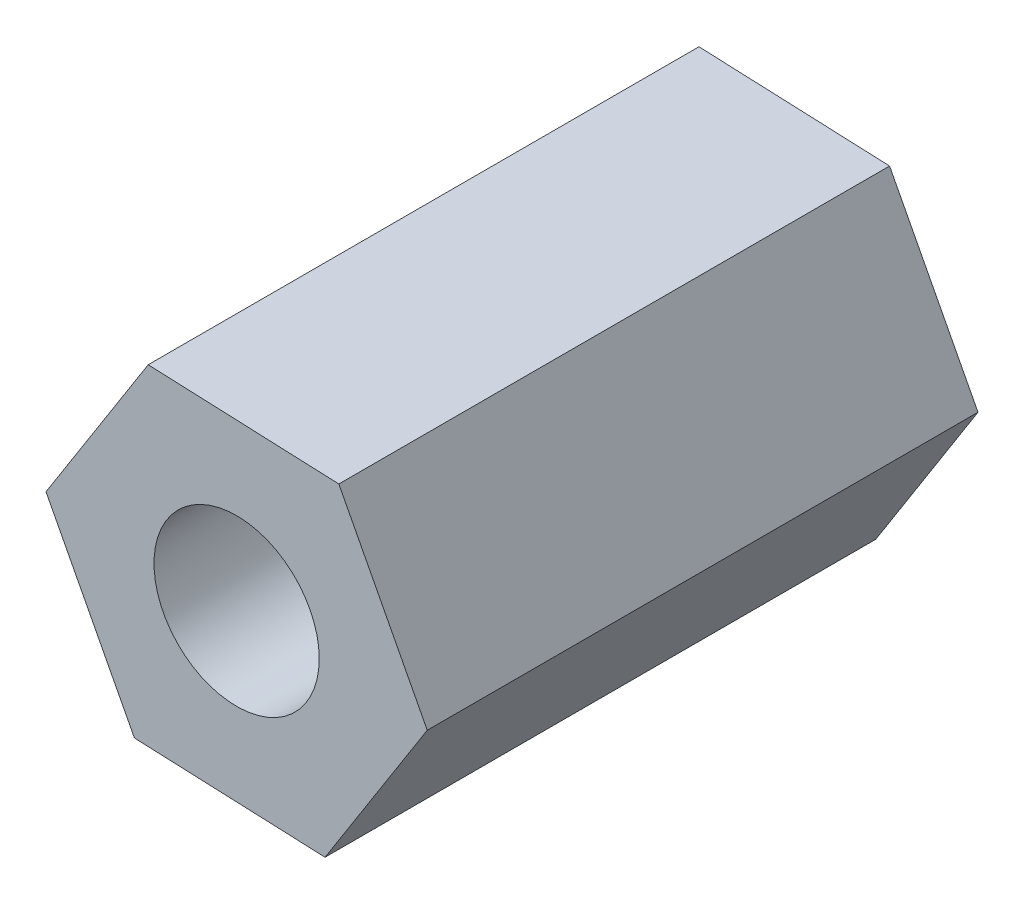
ISO-10303-21;
HEADER;
FILE_DESCRIPTION(('STEP AP214'),'2;1');
FILE_NAME('part.step','',(''),(''),'','','');
FILE_SCHEMA(('AUTOMOTIVE_DESIGN { 1 0 10303 214 1 1 1 1 }'));
ENDSEC;
DATA;
#1=APPLICATION_CONTEXT('core data for automotive mechanical design processes');
#2=APPLICATION_PROTOCOL_DEFINITION('international standard','automotive_design',2000,#1);
#3=PRODUCT_CONTEXT('',#1,'mechanical');
#4=PRODUCT('Part','Part','',(#3));
#5=PRODUCT_RELATED_PRODUCT_CATEGORY('part','',(#4));
#6=PRODUCT_DEFINITION_FORMATION('','',#4);
#7=PRODUCT_DEFINITION_CONTEXT('part definition',#1,'design');
#8=PRODUCT_DEFINITION('design','',#6,#7);
#9=PRODUCT_DEFINITION_SHAPE('','',#8);
#10=(LENGTH_UNIT() NAMED_UNIT(*) SI_UNIT(.MILLI.,.METRE.));
#11=(NAMED_UNIT(*) PLANE_ANGLE_UNIT() SI_UNIT($,.RADIAN.));
#12=(NAMED_UNIT(*) SI_UNIT($,.STERADIAN.) SOLID_ANGLE_UNIT());
#13=UNCERTAINTY_MEASURE_WITH_UNIT(LENGTH_MEASURE(1.E-05),#10,'distance_accuracy_value','');
#14=(GEOMETRIC_REPRESENTATION_CONTEXT(3) GLOBAL_UNCERTAINTY_ASSIGNED_CONTEXT((#13)) GLOBAL_UNIT_ASSIGNED_CONTEXT((#10,
#11,#12)) REPRESENTATION_CONTEXT('',''));
#15=CARTESIAN_POINT('',(0.,0.,0.));
#16=DIRECTION('',(0.,0.,1.));
#17=DIRECTION('',(1.,0.,0.));
#18=AXIS2_PLACEMENT_3D('',#15,#16,#17);
#19=CARTESIAN_POINT('',(6.92216282442899,-0.289243551515516,20.));
#20=DIRECTION('',(-0.886144708344729,-0.463408627317873,0.));
#21=DIRECTION('',(0.463408627317873,-0.886144708344729,0.));
#22=AXIS2_PLACEMENT_3D('',#19,#20,#21);
#23=PLANE('',#22);
#24=DIRECTION('',(-0.463408627317872,0.886144708344729,0.));
#25=VECTOR('',#24,1.);
#26=CARTESIAN_POINT('',(6.92216282442899,-0.289243551515516,0.));
#27=LINE('',#26,#25);
#28=CARTESIAN_POINT('',(6.92216282442899,-0.289243551515516,0.));
#29=VERTEX_POINT('',#28);
#30=CARTESIAN_POINT('',(3.71157367570777,5.85014707932999,0.));
#31=VERTEX_POINT('',#30);
#32=EDGE_CURVE('E121',#29,#31,#27,.T.);
#33=ORIENTED_EDGE('',*,*,#32,.T.);
#34=DIRECTION('',(0.,0.,-1.));
#35=VECTOR('',#34,1.);
#36=CARTESIAN_POINT('',(3.71157367570777,5.85014707932999,20.));
#37=LINE('',#36,#35);
#38=CARTESIAN_POINT('',(3.71157367570777,5.85014707932999,20.));
#39=VERTEX_POINT('',#38);
#40=EDGE_CURVE('E11',#39,#31,#37,.T.);
#41=ORIENTED_EDGE('',*,*,#40,.F.);
#42=DIRECTION('',(-0.463408627317872,0.886144708344729,0.));
#43=VECTOR('',#42,1.);
#44=CARTESIAN_POINT('',(6.92216282442899,-0.289243551515516,20.));
#45=LINE('',#44,#43);
#46=CARTESIAN_POINT('',(6.92216282442899,-0.289243551515516,20.));
#47=VERTEX_POINT('',#46);
#48=EDGE_CURVE('E132',#47,#39,#45,.T.);
#49=ORIENTED_EDGE('',*,*,#48,.F.);
#50=DIRECTION('',(0.,0.,-1.));
#51=VECTOR('',#50,1.);
#52=CARTESIAN_POINT('',(6.92216282442899,-0.289243551515516,20.));
#53=LINE('',#52,#51);
#54=EDGE_CURVE('E117',#47,#29,#53,.T.);
#55=ORIENTED_EDGE('',*,*,#54,.T.);
#56=EDGE_LOOP('',(#33,#41,#49,#55));
#57=FACE_BOUND('',#56,.T.);
#58=ADVANCED_FACE('F37',(#57),#23,.F.);
#59=CARTESIAN_POINT('',(3.71157367570777,5.85014707932999,20.));
#60=DIRECTION('',(-0.0417487105822119,-0.999128142514624,0.));
#61=DIRECTION('',(0.999128142514624,-0.0417487105822119,0.));
#62=AXIS2_PLACEMENT_3D('',#59,#60,#61);
#63=PLANE('',#62);
#64=DIRECTION('',(-0.999128142514624,0.0417487105822119,0.));
#65=VECTOR('',#64,1.);
#66=CARTESIAN_POINT('',(3.71157367570777,5.85014707932999,0.));
#67=LINE('',#66,#65);
#68=CARTESIAN_POINT('',(-3.21058914872122,6.1393906308455,0.));
#69=VERTEX_POINT('',#68);
#70=EDGE_CURVE('E124',#31,#69,#67,.T.);
#71=ORIENTED_EDGE('',*,*,#70,.T.);
#72=DIRECTION('',(0.,0.,-1.));
#73=VECTOR('',#72,1.);
#74=CARTESIAN_POINT('',(-3.21058914872122,6.1393906308455,20.));
#75=LINE('',#74,#73);
#76=CARTESIAN_POINT('',(-3.21058914872122,6.1393906308455,20.));
#77=VERTEX_POINT('',#76);
#78=EDGE_CURVE('E45',#77,#69,#75,.T.);
#79=ORIENTED_EDGE('',*,*,#78,.F.);
#80=DIRECTION('',(-0.999128142514624,0.0417487105822119,0.));
#81=VECTOR('',#80,1.);
#82=CARTESIAN_POINT('',(3.71157367570777,5.85014707932999,20.));
#83=LINE('',#82,#81);
#84=EDGE_CURVE('E90',#39,#77,#83,.T.);
#85=ORIENTED_EDGE('',*,*,#84,.F.);
#86=ORIENTED_EDGE('',*,*,#40,.T.);
#87=EDGE_LOOP('',(#71,#79,#85,#86));
#88=FACE_BOUND('',#87,.T.);
#89=ADVANCED_FACE('F157',(#88),#63,.F.);
#90=CARTESIAN_POINT('',(-3.21058914872122,6.1393906308455,20.));
#91=DIRECTION('',(0.844395997762518,-0.535719515196751,0.));
#92=DIRECTION('',(0.535719515196751,0.844395997762518,0.));
#93=AXIS2_PLACEMENT_3D('',#90,#91,#92);
#94=PLANE('',#93);
#95=DIRECTION('',(-0.535719515196751,-0.844395997762518,0.));
#96=VECTOR('',#95,1.);
#97=CARTESIAN_POINT('',(-3.21058914872122,6.1393906308455,0.));
#98=LINE('',#97,#96);
#99=CARTESIAN_POINT('',(-6.92216282442899,0.289243551515517,0.));
#100=VERTEX_POINT('',#99);
#101=EDGE_CURVE('E127',#69,#100,#98,.T.);
#102=ORIENTED_EDGE('',*,*,#101,.T.);
#103=DIRECTION('',(0.,0.,-1.));
#104=VECTOR('',#103,1.);
#105=CARTESIAN_POINT('',(-6.92216282442899,0.289243551515517,20.));
#106=LINE('',#105,#104);
#107=CARTESIAN_POINT('',(-6.92216282442899,0.289243551515517,20.));
#108=VERTEX_POINT('',#107);
#109=EDGE_CURVE('E112',#108,#100,#106,.T.);
#110=ORIENTED_EDGE('',*,*,#109,.F.);
#111=DIRECTION('',(-0.535719515196751,-0.844395997762518,0.));
#112=VECTOR('',#111,1.);
#113=CARTESIAN_POINT('',(-3.21058914872122,6.1393906308455,20.));
#114=LINE('',#113,#112);
#115=EDGE_CURVE('E103',#77,#108,#114,.T.);
#116=ORIENTED_EDGE('',*,*,#115,.F.);
#117=ORIENTED_EDGE('',*,*,#78,.T.);
#118=EDGE_LOOP('',(#102,#110,#116,#117));
#119=FACE_BOUND('',#118,.T.);
#120=ADVANCED_FACE('F138',(#119),#94,.F.);
#121=CARTESIAN_POINT('',(-6.92216282442899,0.289243551515517,20.));
#122=DIRECTION('',(0.886144708344729,0.463408627317872,0.));
#123=DIRECTION('',(-0.463408627317872,0.886144708344729,0.));
#124=AXIS2_PLACEMENT_3D('',#121,#122,#123);
#125=PLANE('',#124);
#126=DIRECTION('',(0.463408627317872,-0.886144708344729,0.));
#127=VECTOR('',#126,1.);
#128=CARTESIAN_POINT('',(-6.92216282442899,0.289243551515517,0.));
#129=LINE('',#128,#127);
#130=CARTESIAN_POINT('',(-3.71157367570776,-5.85014707932999,0.));
#131=VERTEX_POINT('',#130);
#132=EDGE_CURVE('E111',#100,#131,#129,.T.);
#133=ORIENTED_EDGE('',*,*,#132,.T.);
#134=DIRECTION('',(0.,0.,-1.));
#135=VECTOR('',#134,1.);
#136=CARTESIAN_POINT('',(-3.71157367570776,-5.85014707932999,20.));
#137=LINE('',#136,#135);
#138=CARTESIAN_POINT('',(-3.71157367570776,-5.85014707932999,20.));
#139=VERTEX_POINT('',#138);
#140=EDGE_CURVE('E108',#139,#131,#137,.T.);
#141=ORIENTED_EDGE('',*,*,#140,.F.);
#142=DIRECTION('',(0.463408627317872,-0.886144708344729,0.));
#143=VECTOR('',#142,1.);
#144=CARTESIAN_POINT('',(-6.92216282442899,0.289243551515517,20.));
#145=LINE('',#144,#143);
#146=EDGE_CURVE('E97',#108,#139,#145,.T.);
#147=ORIENTED_EDGE('',*,*,#146,.F.);
#148=ORIENTED_EDGE('',*,*,#109,.T.);
#149=EDGE_LOOP('',(#133,#141,#147,#148));
#150=FACE_BOUND('',#149,.T.);
#151=ADVANCED_FACE('F109',(#150),#125,.F.);
#152=CARTESIAN_POINT('',(-3.71157367570776,-5.85014707932999,20.));
#153=DIRECTION('',(0.0417487105822117,0.999128142514624,0.));
#154=DIRECTION('',(-0.999128142514624,0.0417487105822117,0.));
#155=AXIS2_PLACEMENT_3D('',#152,#153,#154);
#156=PLANE('',#155);
#157=DIRECTION('',(0.999128142514624,-0.0417487105822117,0.));
#158=VECTOR('',#157,1.);
#159=CARTESIAN_POINT('',(-3.71157367570776,-5.85014707932999,0.));
#160=LINE('',#159,#158);
#161=CARTESIAN_POINT('',(3.21058914872122,-6.1393906308455,0.));
#162=VERTEX_POINT('',#161);
#163=EDGE_CURVE('E76',#131,#162,#160,.T.);
#164=ORIENTED_EDGE('',*,*,#163,.T.);
#165=DIRECTION('',(0.,0.,-1.));
#166=VECTOR('',#165,1.);
#167=CARTESIAN_POINT('',(3.21058914872122,-6.1393906308455,20.));
#168=LINE('',#167,#166);
#169=CARTESIAN_POINT('',(3.21058914872122,-6.1393906308455,20.));
#170=VERTEX_POINT('',#169);
#171=EDGE_CURVE('E113',#170,#162,#168,.T.);
#172=ORIENTED_EDGE('',*,*,#171,.F.);
#173=DIRECTION('',(0.999128142514624,-0.0417487105822117,0.));
#174=VECTOR('',#173,1.);
#175=CARTESIAN_POINT('',(-3.71157367570776,-5.85014707932999,20.));
#176=LINE('',#175,#174);
#177=EDGE_CURVE('E101',#139,#170,#176,.T.);
#178=ORIENTED_EDGE('',*,*,#177,.F.);
#179=ORIENTED_EDGE('',*,*,#140,.T.);
#180=EDGE_LOOP('',(#164,#172,#178,#179));
#181=FACE_BOUND('',#180,.T.);
#182=ADVANCED_FACE('F115',(#181),#156,.F.);
#183=CARTESIAN_POINT('',(3.21058914872122,-6.1393906308455,20.));
#184=DIRECTION('',(-0.844395997762517,0.535719515196752,0.));
#185=DIRECTION('',(-0.535719515196752,-0.844395997762517,0.));
#186=AXIS2_PLACEMENT_3D('',#183,#184,#185);
#187=PLANE('',#186);
#188=DIRECTION('',(0.535719515196752,0.844395997762517,0.));
#189=VECTOR('',#188,1.);
#190=CARTESIAN_POINT('',(3.21058914872122,-6.1393906308455,0.));
#191=LINE('',#190,#189);
#192=EDGE_CURVE('E82',#162,#29,#191,.T.);
#193=ORIENTED_EDGE('',*,*,#192,.T.);
#194=ORIENTED_EDGE('',*,*,#54,.F.);
#195=DIRECTION('',(0.535719515196752,0.844395997762517,0.));
#196=VECTOR('',#195,1.);
#197=CARTESIAN_POINT('',(3.21058914872122,-6.1393906308455,20.));
#198=LINE('',#197,#196);
#199=EDGE_CURVE('E53',#170,#47,#198,.T.);
#200=ORIENTED_EDGE('',*,*,#199,.F.);
#201=ORIENTED_EDGE('',*,*,#171,.T.);
#202=EDGE_LOOP('',(#193,#194,#200,#201));
#203=FACE_BOUND('',#202,.T.);
#204=ADVANCED_FACE('F145',(#203),#187,.F.);
#205=CARTESIAN_POINT('',(0.,0.,20.));
#206=DIRECTION('',(0.,0.,1.));
#207=DIRECTION('',(1.,0.,0.));
#208=AXIS2_PLACEMENT_3D('',#205,#206,#207);
#209=PLANE('',#208);
#210=CARTESIAN_POINT('',(0.,0.,20.));
#211=DIRECTION('',(0.,0.,1.));
#212=DIRECTION('',(1.,0.,0.));
#213=AXIS2_PLACEMENT_3D('',#210,#211,#212);
#214=CIRCLE('',#213,3.);
#215=CARTESIAN_POINT('',(3.,0.,20.));
#216=VERTEX_POINT('',#215);
#217=EDGE_CURVE('E244',#216,#216,#214,.T.);
#218=ORIENTED_EDGE('',*,*,#217,.F.);
#219=EDGE_LOOP('',(#218));
#220=FACE_BOUND('',#219,.T.);
#221=ORIENTED_EDGE('',*,*,#48,.T.);
#222=ORIENTED_EDGE('',*,*,#84,.T.);
#223=ORIENTED_EDGE('',*,*,#115,.T.);
#224=ORIENTED_EDGE('',*,*,#146,.T.);
#225=ORIENTED_EDGE('',*,*,#177,.T.);
#226=ORIENTED_EDGE('',*,*,#199,.T.);
#227=EDGE_LOOP('',(#221,#222,#223,#224,#225,#226));
#228=FACE_BOUND('',#227,.T.);
#229=ADVANCED_FACE('F99',(#220,#228),#209,.T.);
#230=CARTESIAN_POINT('',(0.,0.,0.));
#231=DIRECTION('',(0.,0.,1.));
#232=DIRECTION('',(1.,0.,0.));
#233=AXIS2_PLACEMENT_3D('',#230,#231,#232);
#234=PLANE('',#233);
#235=CARTESIAN_POINT('',(0.,0.,0.));
#236=DIRECTION('',(0.,0.,1.));
#237=DIRECTION('',(1.,0.,0.));
#238=AXIS2_PLACEMENT_3D('',#235,#236,#237);
#239=CIRCLE('',#238,3.);
#240=CARTESIAN_POINT('',(3.,0.,0.));
#241=VERTEX_POINT('',#240);
#242=EDGE_CURVE('E125',#241,#241,#239,.T.);
#243=ORIENTED_EDGE('',*,*,#242,.T.);
#244=EDGE_LOOP('',(#243));
#245=FACE_BOUND('',#244,.T.);
#246=ORIENTED_EDGE('',*,*,#32,.F.);
#247=ORIENTED_EDGE('',*,*,#192,.F.);
#248=ORIENTED_EDGE('',*,*,#163,.F.);
#249=ORIENTED_EDGE('',*,*,#132,.F.);
#250=ORIENTED_EDGE('',*,*,#101,.F.);
#251=ORIENTED_EDGE('',*,*,#70,.F.);
#252=EDGE_LOOP('',(#246,#247,#248,#249,#250,#251));
#253=FACE_BOUND('',#252,.T.);
#254=ADVANCED_FACE('F141',(#245,#253),#234,.F.);
#255=CARTESIAN_POINT('',(0.,0.,0.));
#256=DIRECTION('',(0.,0.,1.));
#257=DIRECTION('',(1.,0.,0.));
#258=AXIS2_PLACEMENT_3D('',#255,#256,#257);
#259=CYLINDRICAL_SURFACE('',#258,3.);
#260=ORIENTED_EDGE('',*,*,#242,.F.);
#261=EDGE_LOOP('',(#260));
#262=FACE_BOUND('',#261,.T.);
#263=ORIENTED_EDGE('',*,*,#217,.T.);
#264=EDGE_LOOP('',(#263));
#265=FACE_BOUND('',#264,.T.);
#266=ADVANCED_FACE('F197',(#262,#265),#259,.F.);
#267=CLOSED_SHELL('',(#58,#89,#120,#151,#182,#204,#229,#254,#266));
#268=MANIFOLD_SOLID_BREP('B2',#267);
#269=ADVANCED_BREP_SHAPE_REPRESENTATION('',(#18,#268),#14);
#270=SHAPE_DEFINITION_REPRESENTATION(#9,#269);
ENDSEC;
END-ISO-10303-21;
